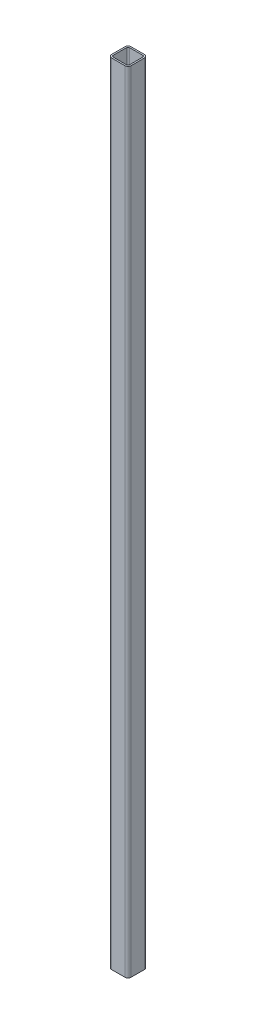
ISO-10303-21;
HEADER;
FILE_DESCRIPTION(('STEP AP214'),'2;1');
FILE_NAME('part.step','',(''),(''),'','','');
FILE_SCHEMA(('AUTOMOTIVE_DESIGN { 1 0 10303 214 1 1 1 1 }'));
ENDSEC;
DATA;
#1=APPLICATION_CONTEXT('core data for automotive mechanical design processes');
#2=APPLICATION_PROTOCOL_DEFINITION('international standard','automotive_design',2000,#1);
#3=PRODUCT_CONTEXT('',#1,'mechanical');
#4=PRODUCT('Part','Part','',(#3));
#5=PRODUCT_RELATED_PRODUCT_CATEGORY('part','',(#4));
#6=PRODUCT_DEFINITION_FORMATION('','',#4);
#7=PRODUCT_DEFINITION_CONTEXT('part definition',#1,'design');
#8=PRODUCT_DEFINITION('design','',#6,#7);
#9=PRODUCT_DEFINITION_SHAPE('','',#8);
#10=(LENGTH_UNIT() NAMED_UNIT(*) SI_UNIT(.MILLI.,.METRE.));
#11=(NAMED_UNIT(*) PLANE_ANGLE_UNIT() SI_UNIT($,.RADIAN.));
#12=(NAMED_UNIT(*) SI_UNIT($,.STERADIAN.) SOLID_ANGLE_UNIT());
#13=UNCERTAINTY_MEASURE_WITH_UNIT(LENGTH_MEASURE(1.E-05),#10,'distance_accuracy_value','');
#14=(GEOMETRIC_REPRESENTATION_CONTEXT(3) GLOBAL_UNCERTAINTY_ASSIGNED_CONTEXT((#13)) GLOBAL_UNIT_ASSIGNED_CONTEXT((#10,
#11,#12)) REPRESENTATION_CONTEXT('',''));
#15=CARTESIAN_POINT('',(0.,0.,0.));
#16=DIRECTION('',(0.,0.,1.));
#17=DIRECTION('',(1.,0.,0.));
#18=AXIS2_PLACEMENT_3D('',#15,#16,#17);
#19=CARTESIAN_POINT('',(-1166.4,-750.,266.4));
#20=DIRECTION('',(0.,1.,0.));
#21=DIRECTION('',(-1.,0.,0.));
#22=AXIS2_PLACEMENT_3D('',#19,#20,#21);
#23=CYLINDRICAL_SURFACE('',#22,6.39999999999996);
#24=CARTESIAN_POINT('',(-1166.4,890.,266.4));
#25=DIRECTION('',(0.,1.,0.));
#26=DIRECTION('',(-1.,0.,0.));
#27=AXIS2_PLACEMENT_3D('',#24,#25,#26);
#28=CIRCLE('',#27,6.39999999999996);
#29=CARTESIAN_POINT('',(-1160.,890.,266.4));
#30=VERTEX_POINT('',#29);
#31=CARTESIAN_POINT('',(-1166.4,890.,260.));
#32=VERTEX_POINT('',#31);
#33=EDGE_CURVE('E22',#30,#32,#28,.T.);
#34=ORIENTED_EDGE('',*,*,#33,.F.);
#35=DIRECTION('',(0.,-1.,0.));
#36=VECTOR('',#35,1.);
#37=CARTESIAN_POINT('',(-1160.,-750.,266.4));
#38=LINE('',#37,#36);
#39=CARTESIAN_POINT('',(-1160.,-730.,266.4));
#40=VERTEX_POINT('',#39);
#41=EDGE_CURVE('E125',#30,#40,#38,.T.);
#42=ORIENTED_EDGE('',*,*,#41,.T.);
#43=CARTESIAN_POINT('',(-1166.4,-730.,266.4));
#44=DIRECTION('',(0.,1.,0.));
#45=DIRECTION('',(-1.,0.,0.));
#46=AXIS2_PLACEMENT_3D('',#43,#44,#45);
#47=CIRCLE('',#46,6.39999999999996);
#48=CARTESIAN_POINT('',(-1166.4,-730.,260.));
#49=VERTEX_POINT('',#48);
#50=EDGE_CURVE('E141',#49,#40,#47,.F.);
#51=ORIENTED_EDGE('',*,*,#50,.F.);
#52=DIRECTION('',(0.,-1.,0.));
#53=VECTOR('',#52,1.);
#54=CARTESIAN_POINT('',(-1166.4,-750.,260.));
#55=LINE('',#54,#53);
#56=EDGE_CURVE('E140',#49,#32,#55,.F.);
#57=ORIENTED_EDGE('',*,*,#56,.T.);
#58=EDGE_LOOP('',(#34,#42,#51,#57));
#59=FACE_BOUND('',#58,.T.);
#60=ADVANCED_FACE('F19',(#59),#23,.T.);
#61=CARTESIAN_POINT('',(-1160.,-750.,293.6));
#62=DIRECTION('',(-1.,0.,0.));
#63=DIRECTION('',(0.,-1.,0.));
#64=AXIS2_PLACEMENT_3D('',#61,#62,#63);
#65=PLANE('',#64);
#66=DIRECTION('',(0.,0.,-1.));
#67=VECTOR('',#66,1.);
#68=CARTESIAN_POINT('',(-1160.,-730.,-880.));
#69=LINE('',#68,#67);
#70=CARTESIAN_POINT('',(-1160.,-730.,293.6));
#71=VERTEX_POINT('',#70);
#72=EDGE_CURVE('E221',#40,#71,#69,.F.);
#73=ORIENTED_EDGE('',*,*,#72,.F.);
#74=ORIENTED_EDGE('',*,*,#41,.F.);
#75=DIRECTION('',(0.,0.,1.));
#76=VECTOR('',#75,1.);
#77=CARTESIAN_POINT('',(-1160.,890.,880.));
#78=LINE('',#77,#76);
#79=CARTESIAN_POINT('',(-1160.,890.,293.6));
#80=VERTEX_POINT('',#79);
#81=EDGE_CURVE('E137',#80,#30,#78,.F.);
#82=ORIENTED_EDGE('',*,*,#81,.F.);
#83=DIRECTION('',(0.,1.,0.));
#84=VECTOR('',#83,1.);
#85=CARTESIAN_POINT('',(-1160.,-750.,293.6));
#86=LINE('',#85,#84);
#87=EDGE_CURVE('E245',#71,#80,#86,.T.);
#88=ORIENTED_EDGE('',*,*,#87,.F.);
#89=EDGE_LOOP('',(#73,#74,#82,#88));
#90=FACE_BOUND('',#89,.T.);
#91=ADVANCED_FACE('F457',(#90),#65,.F.);
#92=CARTESIAN_POINT('',(-1193.6,-750.,266.4));
#93=DIRECTION('',(0.,1.,0.));
#94=DIRECTION('',(-1.,0.,0.));
#95=AXIS2_PLACEMENT_3D('',#92,#93,#94);
#96=CYLINDRICAL_SURFACE('',#95,6.39999999999996);
#97=CARTESIAN_POINT('',(-1193.6,890.,266.4));
#98=DIRECTION('',(0.,1.,0.));
#99=DIRECTION('',(-1.,0.,0.));
#100=AXIS2_PLACEMENT_3D('',#97,#98,#99);
#101=CIRCLE('',#100,6.39999999999996);
#102=CARTESIAN_POINT('',(-1193.6,890.,260.));
#103=VERTEX_POINT('',#102);
#104=CARTESIAN_POINT('',(-1200.,890.,266.4));
#105=VERTEX_POINT('',#104);
#106=EDGE_CURVE('E150',#103,#105,#101,.T.);
#107=ORIENTED_EDGE('',*,*,#106,.F.);
#108=DIRECTION('',(0.,-1.,0.));
#109=VECTOR('',#108,1.);
#110=CARTESIAN_POINT('',(-1193.6,-750.,260.));
#111=LINE('',#110,#109);
#112=CARTESIAN_POINT('',(-1193.6,-730.,260.));
#113=VERTEX_POINT('',#112);
#114=EDGE_CURVE('E146',#103,#113,#111,.T.);
#115=ORIENTED_EDGE('',*,*,#114,.T.);
#116=CARTESIAN_POINT('',(-1193.6,-730.,266.4));
#117=DIRECTION('',(0.,1.,0.));
#118=DIRECTION('',(-1.,0.,0.));
#119=AXIS2_PLACEMENT_3D('',#116,#117,#118);
#120=CIRCLE('',#119,6.39999999999996);
#121=CARTESIAN_POINT('',(-1200.,-730.,266.4));
#122=VERTEX_POINT('',#121);
#123=EDGE_CURVE('E217',#122,#113,#120,.F.);
#124=ORIENTED_EDGE('',*,*,#123,.F.);
#125=DIRECTION('',(0.,1.,0.));
#126=VECTOR('',#125,1.);
#127=CARTESIAN_POINT('',(-1200.,-750.,266.4));
#128=LINE('',#127,#126);
#129=EDGE_CURVE('E157',#122,#105,#128,.T.);
#130=ORIENTED_EDGE('',*,*,#129,.T.);
#131=EDGE_LOOP('',(#107,#115,#124,#130));
#132=FACE_BOUND('',#131,.T.);
#133=ADVANCED_FACE('F448',(#132),#96,.T.);
#134=CARTESIAN_POINT('',(-1193.6,-750.,260.));
#135=DIRECTION('',(0.,0.,1.));
#136=DIRECTION('',(0.,-1.,0.));
#137=AXIS2_PLACEMENT_3D('',#134,#135,#136);
#138=PLANE('',#137);
#139=DIRECTION('',(1.,0.,0.));
#140=VECTOR('',#139,1.);
#141=CARTESIAN_POINT('',(-1193.6,-730.,260.));
#142=LINE('',#141,#140);
#143=EDGE_CURVE('E219',#113,#49,#142,.T.);
#144=ORIENTED_EDGE('',*,*,#143,.F.);
#145=ORIENTED_EDGE('',*,*,#114,.F.);
#146=DIRECTION('',(1.,0.,0.));
#147=VECTOR('',#146,1.);
#148=CARTESIAN_POINT('',(-1193.6,890.,260.));
#149=LINE('',#148,#147);
#150=EDGE_CURVE('E134',#32,#103,#149,.F.);
#151=ORIENTED_EDGE('',*,*,#150,.F.);
#152=ORIENTED_EDGE('',*,*,#56,.F.);
#153=EDGE_LOOP('',(#144,#145,#151,#152));
#154=FACE_BOUND('',#153,.T.);
#155=ADVANCED_FACE('F148',(#154),#138,.F.);
#156=CARTESIAN_POINT('',(-1196.8,-750.,266.4));
#157=DIRECTION('',(1.,0.,0.));
#158=DIRECTION('',(0.,1.,0.));
#159=AXIS2_PLACEMENT_3D('',#156,#157,#158);
#160=PLANE('',#159);
#161=DIRECTION('',(0.,1.,0.));
#162=VECTOR('',#161,1.);
#163=CARTESIAN_POINT('',(-1196.8,-750.,266.4));
#164=LINE('',#163,#162);
#165=CARTESIAN_POINT('',(-1196.8,-730.,266.4));
#166=VERTEX_POINT('',#165);
#167=CARTESIAN_POINT('',(-1196.8,890.,266.4));
#168=VERTEX_POINT('',#167);
#169=EDGE_CURVE('E165',#166,#168,#164,.T.);
#170=ORIENTED_EDGE('',*,*,#169,.T.);
#171=DIRECTION('',(0.,0.,1.));
#172=VECTOR('',#171,1.);
#173=CARTESIAN_POINT('',(-1196.8,890.,880.));
#174=LINE('',#173,#172);
#175=CARTESIAN_POINT('',(-1196.8,890.,293.6));
#176=VERTEX_POINT('',#175);
#177=EDGE_CURVE('E190',#176,#168,#174,.F.);
#178=ORIENTED_EDGE('',*,*,#177,.F.);
#179=DIRECTION('',(0.,1.,0.));
#180=VECTOR('',#179,1.);
#181=CARTESIAN_POINT('',(-1196.8,-750.,293.6));
#182=LINE('',#181,#180);
#183=CARTESIAN_POINT('',(-1196.8,-730.,293.6));
#184=VERTEX_POINT('',#183);
#185=EDGE_CURVE('E145',#176,#184,#182,.F.);
#186=ORIENTED_EDGE('',*,*,#185,.T.);
#187=DIRECTION('',(0.,0.,-1.));
#188=VECTOR('',#187,1.);
#189=CARTESIAN_POINT('',(-1196.8,-730.,-880.));
#190=LINE('',#189,#188);
#191=EDGE_CURVE('E302',#166,#184,#190,.F.);
#192=ORIENTED_EDGE('',*,*,#191,.F.);
#193=EDGE_LOOP('',(#170,#178,#186,#192));
#194=FACE_BOUND('',#193,.T.);
#195=ADVANCED_FACE('F323',(#194),#160,.T.);
#196=CARTESIAN_POINT('',(-1193.6,-750.,293.6));
#197=DIRECTION('',(0.,1.,0.));
#198=DIRECTION('',(-1.,0.,0.));
#199=AXIS2_PLACEMENT_3D('',#196,#197,#198);
#200=CYLINDRICAL_SURFACE('',#199,3.20000000000009);
#201=DIRECTION('',(0.,1.,0.));
#202=VECTOR('',#201,1.);
#203=CARTESIAN_POINT('',(-1193.6,-750.,296.8));
#204=LINE('',#203,#202);
#205=CARTESIAN_POINT('',(-1193.6,-730.,296.8));
#206=VERTEX_POINT('',#205);
#207=CARTESIAN_POINT('',(-1193.6,890.,296.8));
#208=VERTEX_POINT('',#207);
#209=EDGE_CURVE('E278',#206,#208,#204,.T.);
#210=ORIENTED_EDGE('',*,*,#209,.F.);
#211=CARTESIAN_POINT('',(-1193.6,-730.,293.6));
#212=DIRECTION('',(0.,1.,0.));
#213=DIRECTION('',(-1.,0.,0.));
#214=AXIS2_PLACEMENT_3D('',#211,#212,#213);
#215=CIRCLE('',#214,3.20000000000009);
#216=EDGE_CURVE('E301',#184,#206,#215,.T.);
#217=ORIENTED_EDGE('',*,*,#216,.F.);
#218=ORIENTED_EDGE('',*,*,#185,.F.);
#219=CARTESIAN_POINT('',(-1193.6,890.,293.6));
#220=DIRECTION('',(0.,1.,0.));
#221=DIRECTION('',(-1.,0.,0.));
#222=AXIS2_PLACEMENT_3D('',#219,#220,#221);
#223=CIRCLE('',#222,3.20000000000009);
#224=EDGE_CURVE('E191',#208,#176,#223,.F.);
#225=ORIENTED_EDGE('',*,*,#224,.F.);
#226=EDGE_LOOP('',(#210,#217,#218,#225));
#227=FACE_BOUND('',#226,.T.);
#228=ADVANCED_FACE('F321',(#227),#200,.F.);
#229=CARTESIAN_POINT('',(-1166.4,-750.,296.8));
#230=DIRECTION('',(0.,0.,-1.));
#231=DIRECTION('',(0.,1.,0.));
#232=AXIS2_PLACEMENT_3D('',#229,#230,#231);
#233=PLANE('',#232);
#234=ORIENTED_EDGE('',*,*,#209,.T.);
#235=DIRECTION('',(1.,0.,0.));
#236=VECTOR('',#235,1.);
#237=CARTESIAN_POINT('',(-1193.6,890.,296.8));
#238=LINE('',#237,#236);
#239=CARTESIAN_POINT('',(-1166.4,890.,296.8));
#240=VERTEX_POINT('',#239);
#241=EDGE_CURVE('E192',#240,#208,#238,.F.);
#242=ORIENTED_EDGE('',*,*,#241,.F.);
#243=DIRECTION('',(0.,1.,0.));
#244=VECTOR('',#243,1.);
#245=CARTESIAN_POINT('',(-1166.4,-750.,296.8));
#246=LINE('',#245,#244);
#247=CARTESIAN_POINT('',(-1166.4,-730.,296.8));
#248=VERTEX_POINT('',#247);
#249=EDGE_CURVE('E273',#240,#248,#246,.F.);
#250=ORIENTED_EDGE('',*,*,#249,.T.);
#251=DIRECTION('',(1.,0.,0.));
#252=VECTOR('',#251,1.);
#253=CARTESIAN_POINT('',(-1193.6,-730.,296.8));
#254=LINE('',#253,#252);
#255=EDGE_CURVE('E300',#206,#248,#254,.T.);
#256=ORIENTED_EDGE('',*,*,#255,.F.);
#257=EDGE_LOOP('',(#234,#242,#250,#256));
#258=FACE_BOUND('',#257,.T.);
#259=ADVANCED_FACE('F318',(#258),#233,.T.);
#260=CARTESIAN_POINT('',(-1166.4,-750.,293.6));
#261=DIRECTION('',(0.,1.,0.));
#262=DIRECTION('',(-1.,0.,0.));
#263=AXIS2_PLACEMENT_3D('',#260,#261,#262);
#264=CYLINDRICAL_SURFACE('',#263,3.19999999999987);
#265=DIRECTION('',(0.,-1.,0.));
#266=VECTOR('',#265,1.);
#267=CARTESIAN_POINT('',(-1163.2,-750.,293.6));
#268=LINE('',#267,#266);
#269=CARTESIAN_POINT('',(-1163.2,-730.,293.6));
#270=VERTEX_POINT('',#269);
#271=CARTESIAN_POINT('',(-1163.2,890.,293.6));
#272=VERTEX_POINT('',#271);
#273=EDGE_CURVE('E269',#270,#272,#268,.F.);
#274=ORIENTED_EDGE('',*,*,#273,.F.);
#275=CARTESIAN_POINT('',(-1166.4,-730.,293.6));
#276=DIRECTION('',(0.,1.,0.));
#277=DIRECTION('',(-1.,0.,0.));
#278=AXIS2_PLACEMENT_3D('',#275,#276,#277);
#279=CIRCLE('',#278,3.19999999999987);
#280=EDGE_CURVE('E298',#248,#270,#279,.T.);
#281=ORIENTED_EDGE('',*,*,#280,.F.);
#282=ORIENTED_EDGE('',*,*,#249,.F.);
#283=CARTESIAN_POINT('',(-1166.4,890.,293.6));
#284=DIRECTION('',(0.,1.,0.));
#285=DIRECTION('',(-1.,0.,0.));
#286=AXIS2_PLACEMENT_3D('',#283,#284,#285);
#287=CIRCLE('',#286,3.19999999999987);
#288=EDGE_CURVE('E184',#272,#240,#287,.F.);
#289=ORIENTED_EDGE('',*,*,#288,.F.);
#290=EDGE_LOOP('',(#274,#281,#282,#289));
#291=FACE_BOUND('',#290,.T.);
#292=ADVANCED_FACE('F316',(#291),#264,.F.);
#293=CARTESIAN_POINT('',(-1163.2,-750.,293.6));
#294=DIRECTION('',(-1.,0.,0.));
#295=DIRECTION('',(0.,-1.,0.));
#296=AXIS2_PLACEMENT_3D('',#293,#294,#295);
#297=PLANE('',#296);
#298=ORIENTED_EDGE('',*,*,#273,.T.);
#299=DIRECTION('',(0.,0.,1.));
#300=VECTOR('',#299,1.);
#301=CARTESIAN_POINT('',(-1163.2,890.,880.));
#302=LINE('',#301,#300);
#303=CARTESIAN_POINT('',(-1163.2,890.,266.4));
#304=VERTEX_POINT('',#303);
#305=EDGE_CURVE('E179',#304,#272,#302,.T.);
#306=ORIENTED_EDGE('',*,*,#305,.F.);
#307=DIRECTION('',(0.,1.,0.));
#308=VECTOR('',#307,1.);
#309=CARTESIAN_POINT('',(-1163.2,-750.,266.4));
#310=LINE('',#309,#308);
#311=CARTESIAN_POINT('',(-1163.2,-730.,266.4));
#312=VERTEX_POINT('',#311);
#313=EDGE_CURVE('E267',#304,#312,#310,.F.);
#314=ORIENTED_EDGE('',*,*,#313,.T.);
#315=DIRECTION('',(0.,0.,-1.));
#316=VECTOR('',#315,1.);
#317=CARTESIAN_POINT('',(-1163.2,-730.,-880.));
#318=LINE('',#317,#316);
#319=EDGE_CURVE('E297',#270,#312,#318,.T.);
#320=ORIENTED_EDGE('',*,*,#319,.F.);
#321=EDGE_LOOP('',(#298,#306,#314,#320));
#322=FACE_BOUND('',#321,.T.);
#323=ADVANCED_FACE('F312',(#322),#297,.T.);
#324=CARTESIAN_POINT('',(-1166.4,-750.,266.4));
#325=DIRECTION('',(0.,1.,0.));
#326=DIRECTION('',(-1.,0.,0.));
#327=AXIS2_PLACEMENT_3D('',#324,#325,#326);
#328=CYLINDRICAL_SURFACE('',#327,3.19999999999987);
#329=DIRECTION('',(0.,-1.,0.));
#330=VECTOR('',#329,1.);
#331=CARTESIAN_POINT('',(-1166.4,-750.,263.2));
#332=LINE('',#331,#330);
#333=CARTESIAN_POINT('',(-1166.4,-730.,263.2));
#334=VERTEX_POINT('',#333);
#335=CARTESIAN_POINT('',(-1166.4,890.,263.2));
#336=VERTEX_POINT('',#335);
#337=EDGE_CURVE('E166',#334,#336,#332,.F.);
#338=ORIENTED_EDGE('',*,*,#337,.F.);
#339=CARTESIAN_POINT('',(-1166.4,-730.,266.4));
#340=DIRECTION('',(0.,1.,0.));
#341=DIRECTION('',(-1.,0.,0.));
#342=AXIS2_PLACEMENT_3D('',#339,#340,#341);
#343=CIRCLE('',#342,3.19999999999987);
#344=EDGE_CURVE('E295',#312,#334,#343,.T.);
#345=ORIENTED_EDGE('',*,*,#344,.F.);
#346=ORIENTED_EDGE('',*,*,#313,.F.);
#347=CARTESIAN_POINT('',(-1166.4,890.,266.4));
#348=DIRECTION('',(0.,1.,0.));
#349=DIRECTION('',(-1.,0.,0.));
#350=AXIS2_PLACEMENT_3D('',#347,#348,#349);
#351=CIRCLE('',#350,3.19999999999987);
#352=EDGE_CURVE('E185',#336,#304,#351,.F.);
#353=ORIENTED_EDGE('',*,*,#352,.F.);
#354=EDGE_LOOP('',(#338,#345,#346,#353));
#355=FACE_BOUND('',#354,.T.);
#356=ADVANCED_FACE('F310',(#355),#328,.F.);
#357=CARTESIAN_POINT('',(-1193.6,-750.,263.2));
#358=DIRECTION('',(0.,0.,1.));
#359=DIRECTION('',(0.,-1.,0.));
#360=AXIS2_PLACEMENT_3D('',#357,#358,#359);
#361=PLANE('',#360);
#362=ORIENTED_EDGE('',*,*,#337,.T.);
#363=DIRECTION('',(1.,0.,0.));
#364=VECTOR('',#363,1.);
#365=CARTESIAN_POINT('',(-1193.6,890.,263.2));
#366=LINE('',#365,#364);
#367=CARTESIAN_POINT('',(-1193.6,890.,263.2));
#368=VERTEX_POINT('',#367);
#369=EDGE_CURVE('E186',#368,#336,#366,.T.);
#370=ORIENTED_EDGE('',*,*,#369,.F.);
#371=DIRECTION('',(0.,1.,0.));
#372=VECTOR('',#371,1.);
#373=CARTESIAN_POINT('',(-1193.6,-750.,263.2));
#374=LINE('',#373,#372);
#375=CARTESIAN_POINT('',(-1193.6,-730.,263.2));
#376=VERTEX_POINT('',#375);
#377=EDGE_CURVE('E162',#368,#376,#374,.F.);
#378=ORIENTED_EDGE('',*,*,#377,.T.);
#379=DIRECTION('',(1.,0.,0.));
#380=VECTOR('',#379,1.);
#381=CARTESIAN_POINT('',(-1193.6,-730.,263.2));
#382=LINE('',#381,#380);
#383=EDGE_CURVE('E264',#334,#376,#382,.F.);
#384=ORIENTED_EDGE('',*,*,#383,.F.);
#385=EDGE_LOOP('',(#362,#370,#378,#384));
#386=FACE_BOUND('',#385,.T.);
#387=ADVANCED_FACE('F260',(#386),#361,.T.);
#388=CARTESIAN_POINT('',(-1193.6,-750.,266.4));
#389=DIRECTION('',(0.,1.,0.));
#390=DIRECTION('',(-1.,0.,0.));
#391=AXIS2_PLACEMENT_3D('',#388,#389,#390);
#392=CYLINDRICAL_SURFACE('',#391,3.19999999999987);
#393=ORIENTED_EDGE('',*,*,#169,.F.);
#394=CARTESIAN_POINT('',(-1193.6,-730.,266.4));
#395=DIRECTION('',(0.,1.,0.));
#396=DIRECTION('',(-1.,0.,0.));
#397=AXIS2_PLACEMENT_3D('',#394,#395,#396);
#398=CIRCLE('',#397,3.19999999999987);
#399=EDGE_CURVE('E292',#376,#166,#398,.T.);
#400=ORIENTED_EDGE('',*,*,#399,.F.);
#401=ORIENTED_EDGE('',*,*,#377,.F.);
#402=CARTESIAN_POINT('',(-1193.6,890.,266.4));
#403=DIRECTION('',(0.,1.,0.));
#404=DIRECTION('',(-1.,0.,0.));
#405=AXIS2_PLACEMENT_3D('',#402,#403,#404);
#406=CIRCLE('',#405,3.19999999999987);
#407=EDGE_CURVE('E189',#168,#368,#406,.F.);
#408=ORIENTED_EDGE('',*,*,#407,.F.);
#409=EDGE_LOOP('',(#393,#400,#401,#408));
#410=FACE_BOUND('',#409,.T.);
#411=ADVANCED_FACE('F324',(#410),#392,.F.);
#412=CARTESIAN_POINT('',(-1200.,-750.,266.4));
#413=DIRECTION('',(1.,0.,0.));
#414=DIRECTION('',(0.,1.,0.));
#415=AXIS2_PLACEMENT_3D('',#412,#413,#414);
#416=PLANE('',#415);
#417=DIRECTION('',(0.,0.,-1.));
#418=VECTOR('',#417,1.);
#419=CARTESIAN_POINT('',(-1200.,-730.,-880.));
#420=LINE('',#419,#418);
#421=CARTESIAN_POINT('',(-1200.,-730.,293.6));
#422=VERTEX_POINT('',#421);
#423=EDGE_CURVE('E214',#422,#122,#420,.T.);
#424=ORIENTED_EDGE('',*,*,#423,.F.);
#425=DIRECTION('',(0.,1.,0.));
#426=VECTOR('',#425,1.);
#427=CARTESIAN_POINT('',(-1200.,-750.,293.6));
#428=LINE('',#427,#426);
#429=CARTESIAN_POINT('',(-1200.,890.,293.6));
#430=VERTEX_POINT('',#429);
#431=EDGE_CURVE('E158',#430,#422,#428,.F.);
#432=ORIENTED_EDGE('',*,*,#431,.F.);
#433=DIRECTION('',(0.,0.,1.));
#434=VECTOR('',#433,1.);
#435=CARTESIAN_POINT('',(-1200.,890.,880.));
#436=LINE('',#435,#434);
#437=EDGE_CURVE('E152',#105,#430,#436,.T.);
#438=ORIENTED_EDGE('',*,*,#437,.F.);
#439=ORIENTED_EDGE('',*,*,#129,.F.);
#440=EDGE_LOOP('',(#424,#432,#438,#439));
#441=FACE_BOUND('',#440,.T.);
#442=ADVANCED_FACE('F212',(#441),#416,.F.);
#443=CARTESIAN_POINT('',(-1193.6,890.,880.));
#444=DIRECTION('',(0.,1.,0.));
#445=DIRECTION('',(0.,0.,1.));
#446=AXIS2_PLACEMENT_3D('',#443,#444,#445);
#447=PLANE('',#446);
#448=ORIENTED_EDGE('',*,*,#305,.T.);
#449=ORIENTED_EDGE('',*,*,#288,.T.);
#450=ORIENTED_EDGE('',*,*,#241,.T.);
#451=ORIENTED_EDGE('',*,*,#224,.T.);
#452=ORIENTED_EDGE('',*,*,#177,.T.);
#453=ORIENTED_EDGE('',*,*,#407,.T.);
#454=ORIENTED_EDGE('',*,*,#369,.T.);
#455=ORIENTED_EDGE('',*,*,#352,.T.);
#456=EDGE_LOOP('',(#448,#449,#450,#451,#452,#453,#454,#455));
#457=FACE_BOUND('',#456,.T.);
#458=ORIENTED_EDGE('',*,*,#106,.T.);
#459=ORIENTED_EDGE('',*,*,#437,.T.);
#460=CARTESIAN_POINT('',(-1193.6,890.,293.6));
#461=DIRECTION('',(0.,1.,0.));
#462=DIRECTION('',(-1.,0.,0.));
#463=AXIS2_PLACEMENT_3D('',#460,#461,#462);
#464=CIRCLE('',#463,6.39999999999996);
#465=CARTESIAN_POINT('',(-1193.6,890.,300.));
#466=VERTEX_POINT('',#465);
#467=EDGE_CURVE('E161',#466,#430,#464,.F.);
#468=ORIENTED_EDGE('',*,*,#467,.F.);
#469=DIRECTION('',(1.,0.,0.));
#470=VECTOR('',#469,1.);
#471=CARTESIAN_POINT('',(-1166.4,890.,300.));
#472=LINE('',#471,#470);
#473=CARTESIAN_POINT('',(-1166.4,890.,300.));
#474=VERTEX_POINT('',#473);
#475=EDGE_CURVE('E160',#466,#474,#472,.T.);
#476=ORIENTED_EDGE('',*,*,#475,.T.);
#477=CARTESIAN_POINT('',(-1166.4,890.,293.6));
#478=DIRECTION('',(0.,1.,0.));
#479=DIRECTION('',(-1.,0.,0.));
#480=AXIS2_PLACEMENT_3D('',#477,#478,#479);
#481=CIRCLE('',#480,6.39999999999996);
#482=EDGE_CURVE('E243',#80,#474,#481,.F.);
#483=ORIENTED_EDGE('',*,*,#482,.F.);
#484=ORIENTED_EDGE('',*,*,#81,.T.);
#485=ORIENTED_EDGE('',*,*,#33,.T.);
#486=ORIENTED_EDGE('',*,*,#150,.T.);
#487=EDGE_LOOP('',(#458,#459,#468,#476,#483,#484,#485,#486));
#488=FACE_BOUND('',#487,.T.);
#489=ADVANCED_FACE('F132',(#457,#488),#447,.T.);
#490=CARTESIAN_POINT('',(-1166.4,-750.,293.6));
#491=DIRECTION('',(0.,1.,0.));
#492=DIRECTION('',(-1.,0.,0.));
#493=AXIS2_PLACEMENT_3D('',#490,#491,#492);
#494=CYLINDRICAL_SURFACE('',#493,6.39999999999996);
#495=ORIENTED_EDGE('',*,*,#482,.T.);
#496=DIRECTION('',(0.,1.,0.));
#497=VECTOR('',#496,1.);
#498=CARTESIAN_POINT('',(-1166.4,-750.,300.));
#499=LINE('',#498,#497);
#500=CARTESIAN_POINT('',(-1166.4,-730.,300.));
#501=VERTEX_POINT('',#500);
#502=EDGE_CURVE('E229',#474,#501,#499,.F.);
#503=ORIENTED_EDGE('',*,*,#502,.T.);
#504=CARTESIAN_POINT('',(-1166.4,-730.,293.6));
#505=DIRECTION('',(0.,1.,0.));
#506=DIRECTION('',(-1.,0.,0.));
#507=AXIS2_PLACEMENT_3D('',#504,#505,#506);
#508=CIRCLE('',#507,6.39999999999996);
#509=EDGE_CURVE('E218',#71,#501,#508,.F.);
#510=ORIENTED_EDGE('',*,*,#509,.F.);
#511=ORIENTED_EDGE('',*,*,#87,.T.);
#512=EDGE_LOOP('',(#495,#503,#510,#511));
#513=FACE_BOUND('',#512,.T.);
#514=ADVANCED_FACE('F242',(#513),#494,.T.);
#515=CARTESIAN_POINT('',(-1193.6,-730.,-880.));
#516=DIRECTION('',(0.,-1.,0.));
#517=DIRECTION('',(0.,0.,-1.));
#518=AXIS2_PLACEMENT_3D('',#515,#516,#517);
#519=PLANE('',#518);
#520=ORIENTED_EDGE('',*,*,#383,.T.);
#521=ORIENTED_EDGE('',*,*,#399,.T.);
#522=ORIENTED_EDGE('',*,*,#191,.T.);
#523=ORIENTED_EDGE('',*,*,#216,.T.);
#524=ORIENTED_EDGE('',*,*,#255,.T.);
#525=ORIENTED_EDGE('',*,*,#280,.T.);
#526=ORIENTED_EDGE('',*,*,#319,.T.);
#527=ORIENTED_EDGE('',*,*,#344,.T.);
#528=EDGE_LOOP('',(#520,#521,#522,#523,#524,#525,#526,#527));
#529=FACE_BOUND('',#528,.T.);
#530=ORIENTED_EDGE('',*,*,#123,.T.);
#531=ORIENTED_EDGE('',*,*,#143,.T.);
#532=ORIENTED_EDGE('',*,*,#50,.T.);
#533=ORIENTED_EDGE('',*,*,#72,.T.);
#534=ORIENTED_EDGE('',*,*,#509,.T.);
#535=DIRECTION('',(1.,0.,0.));
#536=VECTOR('',#535,1.);
#537=CARTESIAN_POINT('',(-1166.4,-730.,300.));
#538=LINE('',#537,#536);
#539=CARTESIAN_POINT('',(-1193.6,-730.,300.));
#540=VERTEX_POINT('',#539);
#541=EDGE_CURVE('E28',#501,#540,#538,.F.);
#542=ORIENTED_EDGE('',*,*,#541,.T.);
#543=CARTESIAN_POINT('',(-1193.6,-730.,293.6));
#544=DIRECTION('',(0.,1.,0.));
#545=DIRECTION('',(-1.,0.,0.));
#546=AXIS2_PLACEMENT_3D('',#543,#544,#545);
#547=CIRCLE('',#546,6.39999999999996);
#548=EDGE_CURVE('E36',#422,#540,#547,.T.);
#549=ORIENTED_EDGE('',*,*,#548,.F.);
#550=ORIENTED_EDGE('',*,*,#423,.T.);
#551=EDGE_LOOP('',(#530,#531,#532,#533,#534,#542,#549,#550));
#552=FACE_BOUND('',#551,.T.);
#553=ADVANCED_FACE('F235',(#529,#552),#519,.T.);
#554=CARTESIAN_POINT('',(-1193.6,-750.,293.6));
#555=DIRECTION('',(0.,1.,0.));
#556=DIRECTION('',(-1.,0.,0.));
#557=AXIS2_PLACEMENT_3D('',#554,#555,#556);
#558=CYLINDRICAL_SURFACE('',#557,6.39999999999996);
#559=ORIENTED_EDGE('',*,*,#467,.T.);
#560=ORIENTED_EDGE('',*,*,#431,.T.);
#561=ORIENTED_EDGE('',*,*,#548,.T.);
#562=DIRECTION('',(0.,1.,0.));
#563=VECTOR('',#562,1.);
#564=CARTESIAN_POINT('',(-1193.6,-750.,300.));
#565=LINE('',#564,#563);
#566=EDGE_CURVE('E12',#540,#466,#565,.T.);
#567=ORIENTED_EDGE('',*,*,#566,.T.);
#568=EDGE_LOOP('',(#559,#560,#561,#567));
#569=FACE_BOUND('',#568,.T.);
#570=ADVANCED_FACE('F209',(#569),#558,.T.);
#571=CARTESIAN_POINT('',(-1166.4,-750.,300.));
#572=DIRECTION('',(0.,0.,-1.));
#573=DIRECTION('',(0.,1.,0.));
#574=AXIS2_PLACEMENT_3D('',#571,#572,#573);
#575=PLANE('',#574);
#576=ORIENTED_EDGE('',*,*,#541,.F.);
#577=ORIENTED_EDGE('',*,*,#502,.F.);
#578=ORIENTED_EDGE('',*,*,#475,.F.);
#579=ORIENTED_EDGE('',*,*,#566,.F.);
#580=EDGE_LOOP('',(#576,#577,#578,#579));
#581=FACE_BOUND('',#580,.T.);
#582=ADVANCED_FACE('F239',(#581),#575,.F.);
#583=CLOSED_SHELL('',(#60,#91,#133,#155,#195,#228,#259,#292,#323,#356,#387,#411,#442,#489,#514,
#553,#570,#582));
#584=MANIFOLD_SOLID_BREP('B1',#583);
#585=ADVANCED_BREP_SHAPE_REPRESENTATION('',(#18,#584),#14);
#586=SHAPE_DEFINITION_REPRESENTATION(#9,#585);
ENDSEC;
END-ISO-10303-21;
